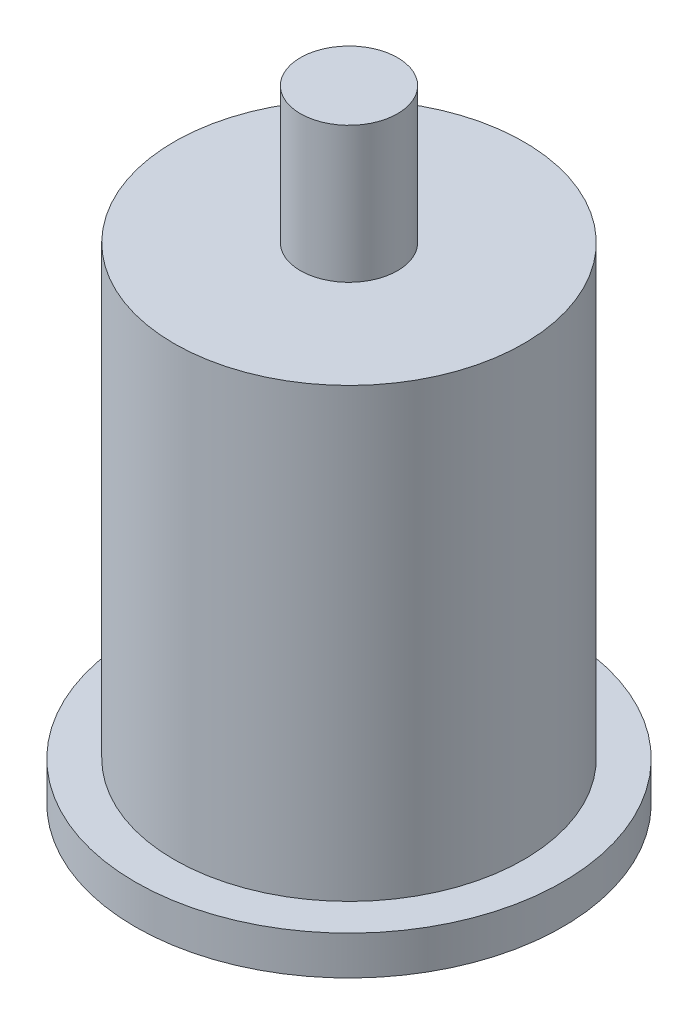
ISO-10303-21;
HEADER;
FILE_DESCRIPTION(('STEP AP214'),'2;1');
FILE_NAME('part.step','',(''),(''),'','','');
FILE_SCHEMA(('AUTOMOTIVE_DESIGN { 1 0 10303 214 1 1 1 1 }'));
ENDSEC;
DATA;
#1=APPLICATION_CONTEXT('core data for automotive mechanical design processes');
#2=APPLICATION_PROTOCOL_DEFINITION('international standard','automotive_design',2000,#1);
#3=PRODUCT_CONTEXT('',#1,'mechanical');
#4=PRODUCT('Part','Part','',(#3));
#5=PRODUCT_RELATED_PRODUCT_CATEGORY('part','',(#4));
#6=PRODUCT_DEFINITION_FORMATION('','',#4);
#7=PRODUCT_DEFINITION_CONTEXT('part definition',#1,'design');
#8=PRODUCT_DEFINITION('design','',#6,#7);
#9=PRODUCT_DEFINITION_SHAPE('','',#8);
#10=(LENGTH_UNIT() NAMED_UNIT(*) SI_UNIT(.MILLI.,.METRE.));
#11=(NAMED_UNIT(*) PLANE_ANGLE_UNIT() SI_UNIT($,.RADIAN.));
#12=(NAMED_UNIT(*) SI_UNIT($,.STERADIAN.) SOLID_ANGLE_UNIT());
#13=UNCERTAINTY_MEASURE_WITH_UNIT(LENGTH_MEASURE(1.E-05),#10,'distance_accuracy_value','');
#14=(GEOMETRIC_REPRESENTATION_CONTEXT(3) GLOBAL_UNCERTAINTY_ASSIGNED_CONTEXT((#13)) GLOBAL_UNIT_ASSIGNED_CONTEXT((#10,
#11,#12)) REPRESENTATION_CONTEXT('',''));
#15=CARTESIAN_POINT('',(0.,0.,0.));
#16=DIRECTION('',(0.,0.,1.));
#17=DIRECTION('',(1.,0.,0.));
#18=AXIS2_PLACEMENT_3D('',#15,#16,#17);
#19=CARTESIAN_POINT('',(15.,-137.5,26.));
#20=DIRECTION('',(0.,-1.,0.));
#21=DIRECTION('',(0.,0.,-1.));
#22=AXIS2_PLACEMENT_3D('',#19,#20,#21);
#23=CYLINDRICAL_SURFACE('',#22,11.);
#24=CARTESIAN_POINT('',(15.,-137.5,26.));
#25=DIRECTION('',(0.,1.,0.));
#26=DIRECTION('',(0.,0.,1.));
#27=AXIS2_PLACEMENT_3D('',#24,#25,#26);
#28=CIRCLE('',#27,11.);
#29=CARTESIAN_POINT('',(15.,-137.5,37.));
#30=VERTEX_POINT('',#29);
#31=EDGE_CURVE('E49',#30,#30,#28,.T.);
#32=ORIENTED_EDGE('',*,*,#31,.F.);
#33=EDGE_LOOP('',(#32));
#34=FACE_BOUND('',#33,.T.);
#35=CARTESIAN_POINT('',(15.,-139.5,26.));
#36=DIRECTION('',(0.,1.,0.));
#37=DIRECTION('',(0.,0.,1.));
#38=AXIS2_PLACEMENT_3D('',#35,#36,#37);
#39=CIRCLE('',#38,11.);
#40=CARTESIAN_POINT('',(15.,-139.5,37.));
#41=VERTEX_POINT('',#40);
#42=EDGE_CURVE('E40',#41,#41,#39,.T.);
#43=ORIENTED_EDGE('',*,*,#42,.T.);
#44=EDGE_LOOP('',(#43));
#45=FACE_BOUND('',#44,.T.);
#46=ADVANCED_FACE('F37',(#34,#45),#23,.T.);
#47=CARTESIAN_POINT('',(15.,-137.5,26.));
#48=DIRECTION('',(0.,1.,0.));
#49=DIRECTION('',(0.,0.,1.));
#50=AXIS2_PLACEMENT_3D('',#47,#48,#49);
#51=PLANE('',#50);
#52=CARTESIAN_POINT('',(15.,-137.5,26.));
#53=DIRECTION('',(0.,1.,0.));
#54=DIRECTION('',(0.,0.,1.));
#55=AXIS2_PLACEMENT_3D('',#52,#53,#54);
#56=CIRCLE('',#55,9.);
#57=CARTESIAN_POINT('',(15.,-137.5,35.));
#58=VERTEX_POINT('',#57);
#59=EDGE_CURVE('E44',#58,#58,#56,.T.);
#60=ORIENTED_EDGE('',*,*,#59,.F.);
#61=EDGE_LOOP('',(#60));
#62=FACE_BOUND('',#61,.T.);
#63=ORIENTED_EDGE('',*,*,#31,.T.);
#64=EDGE_LOOP('',(#63));
#65=FACE_BOUND('',#64,.T.);
#66=ADVANCED_FACE('F66',(#62,#65),#51,.T.);
#67=CARTESIAN_POINT('',(15.,-139.5,26.));
#68=DIRECTION('',(0.,1.,0.));
#69=DIRECTION('',(0.,0.,1.));
#70=AXIS2_PLACEMENT_3D('',#67,#68,#69);
#71=PLANE('',#70);
#72=ORIENTED_EDGE('',*,*,#42,.F.);
#73=EDGE_LOOP('',(#72));
#74=FACE_BOUND('',#73,.T.);
#75=ADVANCED_FACE('F63',(#74),#71,.F.);
#76=CARTESIAN_POINT('',(15.,-114.5,26.));
#77=DIRECTION('',(0.,-1.,0.));
#78=DIRECTION('',(0.,0.,-1.));
#79=AXIS2_PLACEMENT_3D('',#76,#77,#78);
#80=CYLINDRICAL_SURFACE('',#79,9.);
#81=CARTESIAN_POINT('',(15.,-114.5,26.));
#82=DIRECTION('',(0.,1.,0.));
#83=DIRECTION('',(0.,0.,1.));
#84=AXIS2_PLACEMENT_3D('',#81,#82,#83);
#85=CIRCLE('',#84,9.);
#86=CARTESIAN_POINT('',(15.,-114.5,35.));
#87=VERTEX_POINT('',#86);
#88=EDGE_CURVE('E54',#87,#87,#85,.T.);
#89=ORIENTED_EDGE('',*,*,#88,.F.);
#90=EDGE_LOOP('',(#89));
#91=FACE_BOUND('',#90,.T.);
#92=ORIENTED_EDGE('',*,*,#59,.T.);
#93=EDGE_LOOP('',(#92));
#94=FACE_BOUND('',#93,.T.);
#95=ADVANCED_FACE('F65',(#91,#94),#80,.T.);
#96=CARTESIAN_POINT('',(15.,-114.5,26.));
#97=DIRECTION('',(0.,1.,0.));
#98=DIRECTION('',(0.,0.,1.));
#99=AXIS2_PLACEMENT_3D('',#96,#97,#98);
#100=PLANE('',#99);
#101=CARTESIAN_POINT('',(15.,-114.5,26.));
#102=DIRECTION('',(0.,1.,0.));
#103=DIRECTION('',(0.,0.,1.));
#104=AXIS2_PLACEMENT_3D('',#101,#102,#103);
#105=CIRCLE('',#104,2.5);
#106=CARTESIAN_POINT('',(15.,-114.5,28.5));
#107=VERTEX_POINT('',#106);
#108=EDGE_CURVE('E10',#107,#107,#105,.T.);
#109=ORIENTED_EDGE('',*,*,#108,.F.);
#110=EDGE_LOOP('',(#109));
#111=FACE_BOUND('',#110,.T.);
#112=ORIENTED_EDGE('',*,*,#88,.T.);
#113=EDGE_LOOP('',(#112));
#114=FACE_BOUND('',#113,.T.);
#115=ADVANCED_FACE('F71',(#111,#114),#100,.T.);
#116=CARTESIAN_POINT('',(15.,-107.5,26.));
#117=DIRECTION('',(0.,-1.,0.));
#118=DIRECTION('',(0.,0.,-1.));
#119=AXIS2_PLACEMENT_3D('',#116,#117,#118);
#120=CYLINDRICAL_SURFACE('',#119,2.5);
#121=CARTESIAN_POINT('',(15.,-107.5,26.));
#122=DIRECTION('',(0.,1.,0.));
#123=DIRECTION('',(0.,0.,1.));
#124=AXIS2_PLACEMENT_3D('',#121,#122,#123);
#125=CIRCLE('',#124,2.5);
#126=CARTESIAN_POINT('',(15.,-107.5,28.5));
#127=VERTEX_POINT('',#126);
#128=EDGE_CURVE('E53',#127,#127,#125,.T.);
#129=ORIENTED_EDGE('',*,*,#128,.F.);
#130=EDGE_LOOP('',(#129));
#131=FACE_BOUND('',#130,.T.);
#132=ORIENTED_EDGE('',*,*,#108,.T.);
#133=EDGE_LOOP('',(#132));
#134=FACE_BOUND('',#133,.T.);
#135=ADVANCED_FACE('F97',(#131,#134),#120,.T.);
#136=CARTESIAN_POINT('',(15.,-107.5,26.));
#137=DIRECTION('',(0.,1.,0.));
#138=DIRECTION('',(0.,0.,1.));
#139=AXIS2_PLACEMENT_3D('',#136,#137,#138);
#140=PLANE('',#139);
#141=ORIENTED_EDGE('',*,*,#128,.T.);
#142=EDGE_LOOP('',(#141));
#143=FACE_BOUND('',#142,.T.);
#144=ADVANCED_FACE('F105',(#143),#140,.T.);
#145=CLOSED_SHELL('',(#46,#66,#75,#95,#115,#135,#144));
#146=MANIFOLD_SOLID_BREP('B2',#145);
#147=ADVANCED_BREP_SHAPE_REPRESENTATION('',(#18,#146),#14);
#148=SHAPE_DEFINITION_REPRESENTATION(#9,#147);
ENDSEC;
END-ISO-10303-21;
